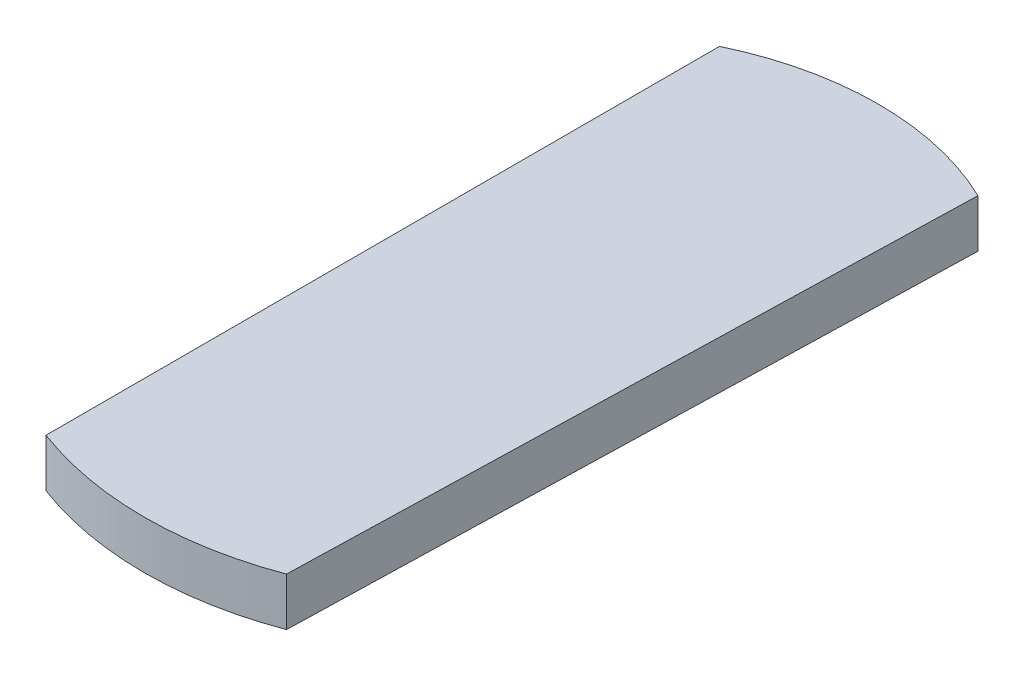
ISO-10303-21;
HEADER;
FILE_DESCRIPTION(('STEP AP214'),'2;1');
FILE_NAME('part.step','',(''),(''),'','','');
FILE_SCHEMA(('AUTOMOTIVE_DESIGN { 1 0 10303 214 1 1 1 1 }'));
ENDSEC;
DATA;
#1=APPLICATION_CONTEXT('core data for automotive mechanical design processes');
#2=APPLICATION_PROTOCOL_DEFINITION('international standard','automotive_design',2000,#1);
#3=PRODUCT_CONTEXT('',#1,'mechanical');
#4=PRODUCT('Part','Part','',(#3));
#5=PRODUCT_RELATED_PRODUCT_CATEGORY('part','',(#4));
#6=PRODUCT_DEFINITION_FORMATION('','',#4);
#7=PRODUCT_DEFINITION_CONTEXT('part definition',#1,'design');
#8=PRODUCT_DEFINITION('design','',#6,#7);
#9=PRODUCT_DEFINITION_SHAPE('','',#8);
#10=(LENGTH_UNIT() NAMED_UNIT(*) SI_UNIT(.MILLI.,.METRE.));
#11=(NAMED_UNIT(*) PLANE_ANGLE_UNIT() SI_UNIT($,.RADIAN.));
#12=(NAMED_UNIT(*) SI_UNIT($,.STERADIAN.) SOLID_ANGLE_UNIT());
#13=UNCERTAINTY_MEASURE_WITH_UNIT(LENGTH_MEASURE(1.E-05),#10,'distance_accuracy_value','');
#14=(GEOMETRIC_REPRESENTATION_CONTEXT(3) GLOBAL_UNCERTAINTY_ASSIGNED_CONTEXT((#13)) GLOBAL_UNIT_ASSIGNED_CONTEXT((#10,
#11,#12)) REPRESENTATION_CONTEXT('',''));
#15=CARTESIAN_POINT('',(0.,0.,0.));
#16=DIRECTION('',(0.,0.,1.));
#17=DIRECTION('',(1.,0.,0.));
#18=AXIS2_PLACEMENT_3D('',#15,#16,#17);
#19=CARTESIAN_POINT('',(12.2796610169491,8.,-18.0834321328718));
#20=DIRECTION('',(0.,-1.,0.));
#21=DIRECTION('',(0.,0.,-1.));
#22=AXIS2_PLACEMENT_3D('',#19,#20,#21);
#23=CYLINDRICAL_SURFACE('',#22,49.5984160680342);
#24=CARTESIAN_POINT('',(12.2796610169491,0.,-18.0834321328718));
#25=DIRECTION('',(0.,1.,0.));
#26=DIRECTION('',(0.,0.,-1.));
#27=AXIS2_PLACEMENT_3D('',#24,#25,#26);
#28=CIRCLE('',#27,49.5984160680342);
#29=CARTESIAN_POINT('',(33.7796610169491,0.,-62.7796610169492));
#30=VERTEX_POINT('',#29);
#31=CARTESIAN_POINT('',(-9.22033898305087,0.,-62.7796610169492));
#32=VERTEX_POINT('',#31);
#33=EDGE_CURVE('E107',#30,#32,#28,.T.);
#34=ORIENTED_EDGE('',*,*,#33,.T.);
#35=DIRECTION('',(0.,-1.,0.));
#36=VECTOR('',#35,1.);
#37=CARTESIAN_POINT('',(-9.22033898305087,8.,-62.7796610169492));
#38=LINE('',#37,#36);
#39=CARTESIAN_POINT('',(-9.22033898305087,8.,-62.7796610169492));
#40=VERTEX_POINT('',#39);
#41=EDGE_CURVE('E11',#40,#32,#38,.T.);
#42=ORIENTED_EDGE('',*,*,#41,.F.);
#43=CARTESIAN_POINT('',(12.2796610169491,8.,-18.0834321328718));
#44=DIRECTION('',(0.,1.,0.));
#45=DIRECTION('',(0.,0.,-1.));
#46=AXIS2_PLACEMENT_3D('',#43,#44,#45);
#47=CIRCLE('',#46,49.5984160680342);
#48=CARTESIAN_POINT('',(33.7796610169491,8.,-62.7796610169492));
#49=VERTEX_POINT('',#48);
#50=EDGE_CURVE('E91',#49,#40,#47,.T.);
#51=ORIENTED_EDGE('',*,*,#50,.F.);
#52=DIRECTION('',(0.,-1.,0.));
#53=VECTOR('',#52,1.);
#54=CARTESIAN_POINT('',(33.7796610169491,8.,-62.7796610169492));
#55=LINE('',#54,#53);
#56=EDGE_CURVE('E103',#49,#30,#55,.T.);
#57=ORIENTED_EDGE('',*,*,#56,.T.);
#58=EDGE_LOOP('',(#34,#42,#51,#57));
#59=FACE_BOUND('',#58,.T.);
#60=ADVANCED_FACE('F39',(#59),#23,.T.);
#61=CARTESIAN_POINT('',(-9.22033898305087,8.,-62.7796610169492));
#62=DIRECTION('',(1.,0.,0.));
#63=DIRECTION('',(0.,0.,-1.));
#64=AXIS2_PLACEMENT_3D('',#61,#62,#63);
#65=PLANE('',#64);
#66=DIRECTION('',(0.,0.,1.));
#67=VECTOR('',#66,1.);
#68=CARTESIAN_POINT('',(-9.22033898305087,0.,-62.7796610169492));
#69=LINE('',#68,#67);
#70=CARTESIAN_POINT('',(-9.22033898305087,0.,49.2203389830509));
#71=VERTEX_POINT('',#70);
#72=EDGE_CURVE('E96',#32,#71,#69,.T.);
#73=ORIENTED_EDGE('',*,*,#72,.T.);
#74=DIRECTION('',(0.,-1.,0.));
#75=VECTOR('',#74,1.);
#76=CARTESIAN_POINT('',(-9.22033898305087,8.,49.2203389830509));
#77=LINE('',#76,#75);
#78=CARTESIAN_POINT('',(-9.22033898305087,8.,49.2203389830509));
#79=VERTEX_POINT('',#78);
#80=EDGE_CURVE('E48',#79,#71,#77,.T.);
#81=ORIENTED_EDGE('',*,*,#80,.F.);
#82=DIRECTION('',(0.,0.,1.));
#83=VECTOR('',#82,1.);
#84=CARTESIAN_POINT('',(-9.22033898305087,8.,-62.7796610169492));
#85=LINE('',#84,#83);
#86=EDGE_CURVE('E86',#40,#79,#85,.T.);
#87=ORIENTED_EDGE('',*,*,#86,.F.);
#88=ORIENTED_EDGE('',*,*,#41,.T.);
#89=EDGE_LOOP('',(#73,#81,#87,#88));
#90=FACE_BOUND('',#89,.T.);
#91=ADVANCED_FACE('F95',(#90),#65,.F.);
#92=CARTESIAN_POINT('',(10.7796610169491,8.,-3.98148782315293));
#93=DIRECTION('',(0.,-1.,0.));
#94=DIRECTION('',(0.,0.,-1.));
#95=AXIS2_PLACEMENT_3D('',#92,#93,#94);
#96=CYLINDRICAL_SURFACE('',#95,56.8369103269812);
#97=CARTESIAN_POINT('',(10.7796610169491,0.,-3.98148782315293));
#98=DIRECTION('',(0.,1.,0.));
#99=DIRECTION('',(0.,0.,1.));
#100=AXIS2_PLACEMENT_3D('',#97,#98,#99);
#101=CIRCLE('',#100,56.8369103269812);
#102=CARTESIAN_POINT('',(30.7796610169492,0.,49.2203389830508));
#103=VERTEX_POINT('',#102);
#104=EDGE_CURVE('E73',#71,#103,#101,.T.);
#105=ORIENTED_EDGE('',*,*,#104,.T.);
#106=DIRECTION('',(0.,-1.,0.));
#107=VECTOR('',#106,1.);
#108=CARTESIAN_POINT('',(30.7796610169492,8.,49.2203389830508));
#109=LINE('',#108,#107);
#110=CARTESIAN_POINT('',(30.7796610169492,8.,49.2203389830508));
#111=VERTEX_POINT('',#110);
#112=EDGE_CURVE('E98',#111,#103,#109,.T.);
#113=ORIENTED_EDGE('',*,*,#112,.F.);
#114=CARTESIAN_POINT('',(10.7796610169491,8.,-3.98148782315293));
#115=DIRECTION('',(0.,1.,0.));
#116=DIRECTION('',(0.,0.,1.));
#117=AXIS2_PLACEMENT_3D('',#114,#115,#116);
#118=CIRCLE('',#117,56.8369103269812);
#119=EDGE_CURVE('E89',#79,#111,#118,.T.);
#120=ORIENTED_EDGE('',*,*,#119,.F.);
#121=ORIENTED_EDGE('',*,*,#80,.T.);
#122=EDGE_LOOP('',(#105,#113,#120,#121));
#123=FACE_BOUND('',#122,.T.);
#124=ADVANCED_FACE('F99',(#123),#96,.T.);
#125=CARTESIAN_POINT('',(30.7796610169491,8.,49.2203389830509));
#126=DIRECTION('',(-0.999641455678374,0.,-0.0267761104199562));
#127=DIRECTION('',(-0.0267761104199563,0.,0.999641455678374));
#128=AXIS2_PLACEMENT_3D('',#125,#126,#127);
#129=PLANE('',#128);
#130=DIRECTION('',(0.0267761104199562,0.,-0.999641455678374));
#131=VECTOR('',#130,1.);
#132=CARTESIAN_POINT('',(30.7796610169491,0.,49.2203389830509));
#133=LINE('',#132,#131);
#134=EDGE_CURVE('E79',#103,#30,#133,.T.);
#135=ORIENTED_EDGE('',*,*,#134,.T.);
#136=ORIENTED_EDGE('',*,*,#56,.F.);
#137=DIRECTION('',(0.0267761104199562,0.,-0.999641455678374));
#138=VECTOR('',#137,1.);
#139=CARTESIAN_POINT('',(30.7796610169491,8.,49.2203389830509));
#140=LINE('',#139,#138);
#141=EDGE_CURVE('E56',#111,#49,#140,.T.);
#142=ORIENTED_EDGE('',*,*,#141,.F.);
#143=ORIENTED_EDGE('',*,*,#112,.T.);
#144=EDGE_LOOP('',(#135,#136,#142,#143));
#145=FACE_BOUND('',#144,.T.);
#146=ADVANCED_FACE('F120',(#145),#129,.F.);
#147=CARTESIAN_POINT('',(12.2796610169491,8.,-18.0834321328718));
#148=DIRECTION('',(0.,-1.,0.));
#149=DIRECTION('',(0.,0.,-1.));
#150=AXIS2_PLACEMENT_3D('',#147,#148,#149);
#151=PLANE('',#150);
#152=ORIENTED_EDGE('',*,*,#50,.T.);
#153=ORIENTED_EDGE('',*,*,#86,.T.);
#154=ORIENTED_EDGE('',*,*,#119,.T.);
#155=ORIENTED_EDGE('',*,*,#141,.T.);
#156=EDGE_LOOP('',(#152,#153,#154,#155));
#157=FACE_BOUND('',#156,.T.);
#158=ADVANCED_FACE('F87',(#157),#151,.F.);
#159=CARTESIAN_POINT('',(12.2796610169491,0.,-18.0834321328718));
#160=DIRECTION('',(0.,-1.,0.));
#161=DIRECTION('',(0.,0.,-1.));
#162=AXIS2_PLACEMENT_3D('',#159,#160,#161);
#163=PLANE('',#162);
#164=ORIENTED_EDGE('',*,*,#33,.F.);
#165=ORIENTED_EDGE('',*,*,#134,.F.);
#166=ORIENTED_EDGE('',*,*,#104,.F.);
#167=ORIENTED_EDGE('',*,*,#72,.F.);
#168=EDGE_LOOP('',(#164,#165,#166,#167));
#169=FACE_BOUND('',#168,.T.);
#170=ADVANCED_FACE('F123',(#169),#163,.T.);
#171=CLOSED_SHELL('',(#60,#91,#124,#146,#158,#170));
#172=MANIFOLD_SOLID_BREP('B2',#171);
#173=ADVANCED_BREP_SHAPE_REPRESENTATION('',(#18,#172),#14);
#174=SHAPE_DEFINITION_REPRESENTATION(#9,#173);
ENDSEC;
END-ISO-10303-21;
